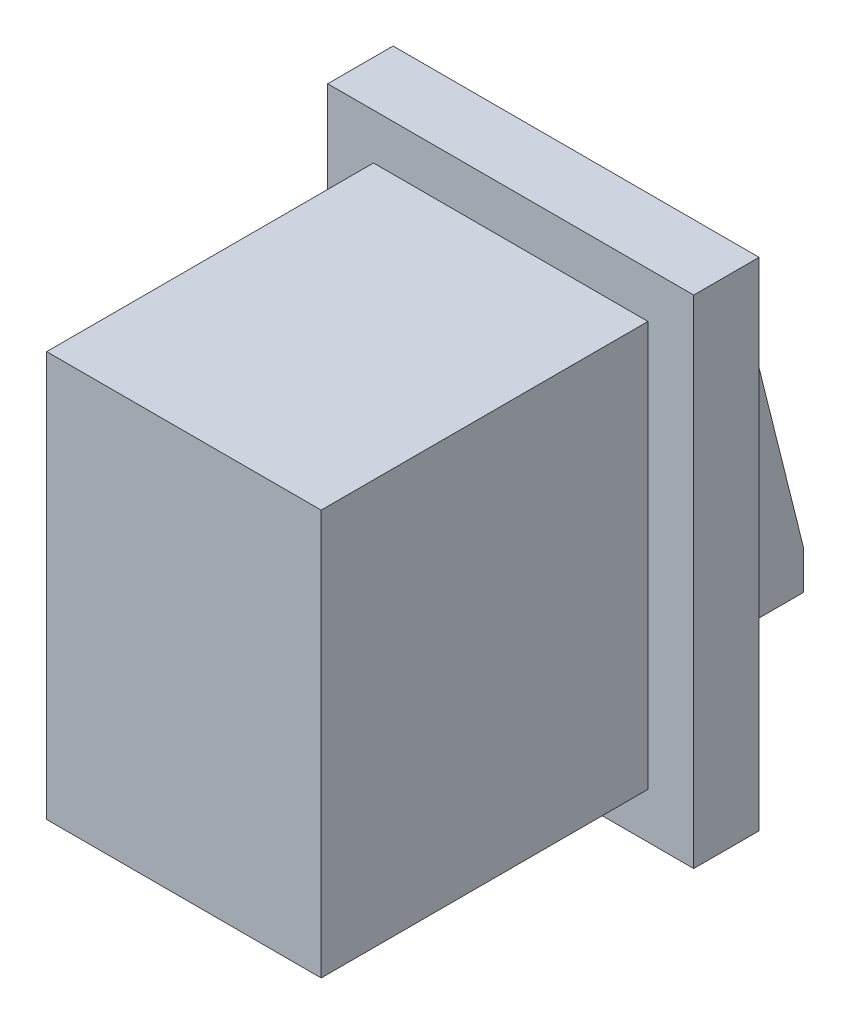
ISO-10303-21;
HEADER;
FILE_DESCRIPTION(('STEP AP214'),'2;1');
FILE_NAME('part.step','',(''),(''),'','','');
FILE_SCHEMA(('AUTOMOTIVE_DESIGN { 1 0 10303 214 1 1 1 1 }'));
ENDSEC;
DATA;
#1=APPLICATION_CONTEXT('core data for automotive mechanical design processes');
#2=APPLICATION_PROTOCOL_DEFINITION('international standard','automotive_design',2000,#1);
#3=PRODUCT_CONTEXT('',#1,'mechanical');
#4=PRODUCT('Part','Part','',(#3));
#5=PRODUCT_RELATED_PRODUCT_CATEGORY('part','',(#4));
#6=PRODUCT_DEFINITION_FORMATION('','',#4);
#7=PRODUCT_DEFINITION_CONTEXT('part definition',#1,'design');
#8=PRODUCT_DEFINITION('design','',#6,#7);
#9=PRODUCT_DEFINITION_SHAPE('','',#8);
#10=(LENGTH_UNIT() NAMED_UNIT(*) SI_UNIT(.MILLI.,.METRE.));
#11=(NAMED_UNIT(*) PLANE_ANGLE_UNIT() SI_UNIT($,.RADIAN.));
#12=(NAMED_UNIT(*) SI_UNIT($,.STERADIAN.) SOLID_ANGLE_UNIT());
#13=UNCERTAINTY_MEASURE_WITH_UNIT(LENGTH_MEASURE(1.E-05),#10,'distance_accuracy_value','');
#14=(GEOMETRIC_REPRESENTATION_CONTEXT(3) GLOBAL_UNCERTAINTY_ASSIGNED_CONTEXT((#13)) GLOBAL_UNIT_ASSIGNED_CONTEXT((#10,
#11,#12)) REPRESENTATION_CONTEXT('',''));
#15=CARTESIAN_POINT('',(0.,0.,0.));
#16=DIRECTION('',(0.,0.,1.));
#17=DIRECTION('',(1.,0.,0.));
#18=AXIS2_PLACEMENT_3D('',#15,#16,#17);
#19=CARTESIAN_POINT('',(0.,0.,-5.));
#20=DIRECTION('',(0.,0.,1.));
#21=DIRECTION('',(1.,0.,0.));
#22=AXIS2_PLACEMENT_3D('',#19,#20,#21);
#23=PLANE('',#22);
#24=DIRECTION('',(0.,1.,0.));
#25=VECTOR('',#24,1.);
#26=CARTESIAN_POINT('',(-14.,-19.,-5.));
#27=LINE('',#26,#25);
#28=CARTESIAN_POINT('',(-14.,-19.,-5.));
#29=VERTEX_POINT('',#28);
#30=CARTESIAN_POINT('',(-14.,19.,-5.));
#31=VERTEX_POINT('',#30);
#32=EDGE_CURVE('E166',#29,#31,#27,.T.);
#33=ORIENTED_EDGE('',*,*,#32,.T.);
#34=DIRECTION('',(1.,0.,0.));
#35=VECTOR('',#34,1.);
#36=CARTESIAN_POINT('',(14.,19.,-5.));
#37=LINE('',#36,#35);
#38=CARTESIAN_POINT('',(14.,19.,-5.));
#39=VERTEX_POINT('',#38);
#40=EDGE_CURVE('E169',#31,#39,#37,.T.);
#41=ORIENTED_EDGE('',*,*,#40,.T.);
#42=DIRECTION('',(0.,-1.,0.));
#43=VECTOR('',#42,1.);
#44=CARTESIAN_POINT('',(14.,-19.,-5.));
#45=LINE('',#44,#43);
#46=CARTESIAN_POINT('',(14.,-19.,-5.));
#47=VERTEX_POINT('',#46);
#48=EDGE_CURVE('E172',#39,#47,#45,.T.);
#49=ORIENTED_EDGE('',*,*,#48,.T.);
#50=DIRECTION('',(-1.,0.,0.));
#51=VECTOR('',#50,1.);
#52=CARTESIAN_POINT('',(14.,-19.,-5.));
#53=LINE('',#52,#51);
#54=EDGE_CURVE('E174',#47,#29,#53,.T.);
#55=ORIENTED_EDGE('',*,*,#54,.T.);
#56=EDGE_LOOP('',(#33,#41,#49,#55));
#57=FACE_BOUND('',#56,.T.);
#58=DIRECTION('',(0.,1.,0.));
#59=VECTOR('',#58,1.);
#60=CARTESIAN_POINT('',(-7.38426730612218,-11.5191078344026,-5.));
#61=LINE('',#60,#59);
#62=CARTESIAN_POINT('',(-7.38426730612218,-11.5191078344026,-5.));
#63=VERTEX_POINT('',#62);
#64=CARTESIAN_POINT('',(-7.38426730612218,11.5191078344026,-5.));
#65=VERTEX_POINT('',#64);
#66=EDGE_CURVE('E153',#63,#65,#61,.T.);
#67=ORIENTED_EDGE('',*,*,#66,.F.);
#68=DIRECTION('',(-1.,0.,0.));
#69=VECTOR('',#68,1.);
#70=CARTESIAN_POINT('',(7.38426730612218,-11.5191078344026,-5.));
#71=LINE('',#70,#69);
#72=CARTESIAN_POINT('',(7.38426730612218,-11.5191078344026,-5.));
#73=VERTEX_POINT('',#72);
#74=EDGE_CURVE('E160',#73,#63,#71,.T.);
#75=ORIENTED_EDGE('',*,*,#74,.F.);
#76=DIRECTION('',(0.,-1.,0.));
#77=VECTOR('',#76,1.);
#78=CARTESIAN_POINT('',(7.38426730612218,-11.5191078344026,-5.));
#79=LINE('',#78,#77);
#80=CARTESIAN_POINT('',(7.38426730612218,11.5191078344026,-5.));
#81=VERTEX_POINT('',#80);
#82=EDGE_CURVE('E140',#81,#73,#79,.T.);
#83=ORIENTED_EDGE('',*,*,#82,.F.);
#84=DIRECTION('',(1.,0.,0.));
#85=VECTOR('',#84,1.);
#86=CARTESIAN_POINT('',(7.38426730612218,11.5191078344026,-5.));
#87=LINE('',#86,#85);
#88=EDGE_CURVE('E156',#65,#81,#87,.T.);
#89=ORIENTED_EDGE('',*,*,#88,.F.);
#90=EDGE_LOOP('',(#67,#75,#83,#89));
#91=FACE_BOUND('',#90,.T.);
#92=ADVANCED_FACE('F32',(#57,#91),#23,.F.);
#93=CARTESIAN_POINT('',(10.5,-15.5,25.));
#94=DIRECTION('',(-1.,0.,0.));
#95=DIRECTION('',(0.,0.,1.));
#96=AXIS2_PLACEMENT_3D('',#93,#94,#95);
#97=PLANE('',#96);
#98=DIRECTION('',(0.,1.,0.));
#99=VECTOR('',#98,1.);
#100=CARTESIAN_POINT('',(10.5,-15.5,0.));
#101=LINE('',#100,#99);
#102=CARTESIAN_POINT('',(10.5,-15.5,0.));
#103=VERTEX_POINT('',#102);
#104=CARTESIAN_POINT('',(10.5,15.5,0.));
#105=VERTEX_POINT('',#104);
#106=EDGE_CURVE('E195',#103,#105,#101,.T.);
#107=ORIENTED_EDGE('',*,*,#106,.T.);
#108=DIRECTION('',(0.,0.,-1.));
#109=VECTOR('',#108,1.);
#110=CARTESIAN_POINT('',(10.5,15.5,25.));
#111=LINE('',#110,#109);
#112=CARTESIAN_POINT('',(10.5,15.5,25.));
#113=VERTEX_POINT('',#112);
#114=EDGE_CURVE('E225',#113,#105,#111,.T.);
#115=ORIENTED_EDGE('',*,*,#114,.F.);
#116=DIRECTION('',(0.,1.,0.));
#117=VECTOR('',#116,1.);
#118=CARTESIAN_POINT('',(10.5,-15.5,25.));
#119=LINE('',#118,#117);
#120=CARTESIAN_POINT('',(10.5,-15.5,25.));
#121=VERTEX_POINT('',#120);
#122=EDGE_CURVE('E196',#121,#113,#119,.T.);
#123=ORIENTED_EDGE('',*,*,#122,.F.);
#124=DIRECTION('',(0.,0.,-1.));
#125=VECTOR('',#124,1.);
#126=CARTESIAN_POINT('',(10.5,-15.5,25.));
#127=LINE('',#126,#125);
#128=EDGE_CURVE('E206',#121,#103,#127,.T.);
#129=ORIENTED_EDGE('',*,*,#128,.T.);
#130=EDGE_LOOP('',(#107,#115,#123,#129));
#131=FACE_BOUND('',#130,.T.);
#132=ADVANCED_FACE('F235',(#131),#97,.F.);
#133=CARTESIAN_POINT('',(-10.5,15.5,25.));
#134=DIRECTION('',(0.,-1.,0.));
#135=DIRECTION('',(0.,0.,-1.));
#136=AXIS2_PLACEMENT_3D('',#133,#134,#135);
#137=PLANE('',#136);
#138=DIRECTION('',(-1.,0.,0.));
#139=VECTOR('',#138,1.);
#140=CARTESIAN_POINT('',(-10.5,15.5,0.));
#141=LINE('',#140,#139);
#142=CARTESIAN_POINT('',(-10.5,15.5,0.));
#143=VERTEX_POINT('',#142);
#144=EDGE_CURVE('E209',#105,#143,#141,.T.);
#145=ORIENTED_EDGE('',*,*,#144,.T.);
#146=DIRECTION('',(0.,0.,-1.));
#147=VECTOR('',#146,1.);
#148=CARTESIAN_POINT('',(-10.5,15.5,25.));
#149=LINE('',#148,#147);
#150=CARTESIAN_POINT('',(-10.5,15.5,25.));
#151=VERTEX_POINT('',#150);
#152=EDGE_CURVE('E222',#151,#143,#149,.T.);
#153=ORIENTED_EDGE('',*,*,#152,.F.);
#154=DIRECTION('',(-1.,0.,0.));
#155=VECTOR('',#154,1.);
#156=CARTESIAN_POINT('',(-10.5,15.5,25.));
#157=LINE('',#156,#155);
#158=EDGE_CURVE('E199',#113,#151,#157,.T.);
#159=ORIENTED_EDGE('',*,*,#158,.F.);
#160=ORIENTED_EDGE('',*,*,#114,.T.);
#161=EDGE_LOOP('',(#145,#153,#159,#160));
#162=FACE_BOUND('',#161,.T.);
#163=ADVANCED_FACE('F231',(#162),#137,.F.);
#164=CARTESIAN_POINT('',(-10.5,-15.5,25.));
#165=DIRECTION('',(1.,0.,0.));
#166=DIRECTION('',(0.,0.,-1.));
#167=AXIS2_PLACEMENT_3D('',#164,#165,#166);
#168=PLANE('',#167);
#169=DIRECTION('',(0.,-1.,0.));
#170=VECTOR('',#169,1.);
#171=CARTESIAN_POINT('',(-10.5,-15.5,0.));
#172=LINE('',#171,#170);
#173=CARTESIAN_POINT('',(-10.5,-15.5,0.));
#174=VERTEX_POINT('',#173);
#175=EDGE_CURVE('E212',#143,#174,#172,.T.);
#176=ORIENTED_EDGE('',*,*,#175,.T.);
#177=DIRECTION('',(0.,0.,-1.));
#178=VECTOR('',#177,1.);
#179=CARTESIAN_POINT('',(-10.5,-15.5,25.));
#180=LINE('',#179,#178);
#181=CARTESIAN_POINT('',(-10.5,-15.5,25.));
#182=VERTEX_POINT('',#181);
#183=EDGE_CURVE('E219',#182,#174,#180,.T.);
#184=ORIENTED_EDGE('',*,*,#183,.F.);
#185=DIRECTION('',(0.,-1.,0.));
#186=VECTOR('',#185,1.);
#187=CARTESIAN_POINT('',(-10.5,-15.5,25.));
#188=LINE('',#187,#186);
#189=EDGE_CURVE('E202',#151,#182,#188,.T.);
#190=ORIENTED_EDGE('',*,*,#189,.F.);
#191=ORIENTED_EDGE('',*,*,#152,.T.);
#192=EDGE_LOOP('',(#176,#184,#190,#191));
#193=FACE_BOUND('',#192,.T.);
#194=ADVANCED_FACE('F245',(#193),#168,.F.);
#195=CARTESIAN_POINT('',(-10.5,-15.5,25.));
#196=DIRECTION('',(0.,1.,0.));
#197=DIRECTION('',(0.,0.,1.));
#198=AXIS2_PLACEMENT_3D('',#195,#196,#197);
#199=PLANE('',#198);
#200=DIRECTION('',(1.,0.,0.));
#201=VECTOR('',#200,1.);
#202=CARTESIAN_POINT('',(-10.5,-15.5,0.));
#203=LINE('',#202,#201);
#204=EDGE_CURVE('E200',#174,#103,#203,.T.);
#205=ORIENTED_EDGE('',*,*,#204,.T.);
#206=ORIENTED_EDGE('',*,*,#128,.F.);
#207=DIRECTION('',(1.,0.,0.));
#208=VECTOR('',#207,1.);
#209=CARTESIAN_POINT('',(-10.5,-15.5,25.));
#210=LINE('',#209,#208);
#211=EDGE_CURVE('E204',#182,#121,#210,.T.);
#212=ORIENTED_EDGE('',*,*,#211,.F.);
#213=ORIENTED_EDGE('',*,*,#183,.T.);
#214=EDGE_LOOP('',(#205,#206,#212,#213));
#215=FACE_BOUND('',#214,.T.);
#216=ADVANCED_FACE('F240',(#215),#199,.F.);
#217=CARTESIAN_POINT('',(0.,0.,25.));
#218=DIRECTION('',(0.,0.,-1.));
#219=DIRECTION('',(-1.,0.,0.));
#220=AXIS2_PLACEMENT_3D('',#217,#218,#219);
#221=PLANE('',#220);
#222=ORIENTED_EDGE('',*,*,#122,.T.);
#223=ORIENTED_EDGE('',*,*,#158,.T.);
#224=ORIENTED_EDGE('',*,*,#189,.T.);
#225=ORIENTED_EDGE('',*,*,#211,.T.);
#226=EDGE_LOOP('',(#222,#223,#224,#225));
#227=FACE_BOUND('',#226,.T.);
#228=ADVANCED_FACE('F247',(#227),#221,.F.);
#229=CARTESIAN_POINT('',(0.,0.,0.));
#230=DIRECTION('',(0.,0.,1.));
#231=DIRECTION('',(1.,0.,0.));
#232=AXIS2_PLACEMENT_3D('',#229,#230,#231);
#233=PLANE('',#232);
#234=DIRECTION('',(0.,1.,0.));
#235=VECTOR('',#234,1.);
#236=CARTESIAN_POINT('',(-14.,-19.,0.));
#237=LINE('',#236,#235);
#238=CARTESIAN_POINT('',(-14.,-19.,0.));
#239=VERTEX_POINT('',#238);
#240=CARTESIAN_POINT('',(-14.,19.,0.));
#241=VERTEX_POINT('',#240);
#242=EDGE_CURVE('E165',#239,#241,#237,.T.);
#243=ORIENTED_EDGE('',*,*,#242,.F.);
#244=DIRECTION('',(-1.,0.,0.));
#245=VECTOR('',#244,1.);
#246=CARTESIAN_POINT('',(14.,-19.,0.));
#247=LINE('',#246,#245);
#248=CARTESIAN_POINT('',(14.,-19.,0.));
#249=VERTEX_POINT('',#248);
#250=EDGE_CURVE('E170',#249,#239,#247,.T.);
#251=ORIENTED_EDGE('',*,*,#250,.F.);
#252=DIRECTION('',(0.,-1.,0.));
#253=VECTOR('',#252,1.);
#254=CARTESIAN_POINT('',(14.,-19.,0.));
#255=LINE('',#254,#253);
#256=CARTESIAN_POINT('',(14.,19.,0.));
#257=VERTEX_POINT('',#256);
#258=EDGE_CURVE('E181',#257,#249,#255,.T.);
#259=ORIENTED_EDGE('',*,*,#258,.F.);
#260=DIRECTION('',(1.,0.,0.));
#261=VECTOR('',#260,1.);
#262=CARTESIAN_POINT('',(14.,19.,0.));
#263=LINE('',#262,#261);
#264=EDGE_CURVE('E179',#241,#257,#263,.T.);
#265=ORIENTED_EDGE('',*,*,#264,.F.);
#266=EDGE_LOOP('',(#243,#251,#259,#265));
#267=FACE_BOUND('',#266,.T.);
#268=ORIENTED_EDGE('',*,*,#106,.F.);
#269=ORIENTED_EDGE('',*,*,#204,.F.);
#270=ORIENTED_EDGE('',*,*,#175,.F.);
#271=ORIENTED_EDGE('',*,*,#144,.F.);
#272=EDGE_LOOP('',(#268,#269,#270,#271));
#273=FACE_BOUND('',#272,.T.);
#274=ADVANCED_FACE('F238',(#267,#273),#233,.T.);
#275=CARTESIAN_POINT('',(-14.,-19.,-5.));
#276=DIRECTION('',(1.,0.,0.));
#277=DIRECTION('',(0.,0.,-1.));
#278=AXIS2_PLACEMENT_3D('',#275,#276,#277);
#279=PLANE('',#278);
#280=ORIENTED_EDGE('',*,*,#242,.T.);
#281=DIRECTION('',(0.,0.,1.));
#282=VECTOR('',#281,1.);
#283=CARTESIAN_POINT('',(-14.,19.,-5.));
#284=LINE('',#283,#282);
#285=EDGE_CURVE('E192',#31,#241,#284,.T.);
#286=ORIENTED_EDGE('',*,*,#285,.F.);
#287=ORIENTED_EDGE('',*,*,#32,.F.);
#288=DIRECTION('',(0.,0.,1.));
#289=VECTOR('',#288,1.);
#290=CARTESIAN_POINT('',(-14.,-19.,-5.));
#291=LINE('',#290,#289);
#292=EDGE_CURVE('E176',#29,#239,#291,.T.);
#293=ORIENTED_EDGE('',*,*,#292,.T.);
#294=EDGE_LOOP('',(#280,#286,#287,#293));
#295=FACE_BOUND('',#294,.T.);
#296=ADVANCED_FACE('F254',(#295),#279,.F.);
#297=CARTESIAN_POINT('',(14.,19.,-5.));
#298=DIRECTION('',(0.,-1.,0.));
#299=DIRECTION('',(0.,0.,-1.));
#300=AXIS2_PLACEMENT_3D('',#297,#298,#299);
#301=PLANE('',#300);
#302=ORIENTED_EDGE('',*,*,#264,.T.);
#303=DIRECTION('',(0.,0.,1.));
#304=VECTOR('',#303,1.);
#305=CARTESIAN_POINT('',(14.,19.,-5.));
#306=LINE('',#305,#304);
#307=EDGE_CURVE('E189',#39,#257,#306,.T.);
#308=ORIENTED_EDGE('',*,*,#307,.F.);
#309=ORIENTED_EDGE('',*,*,#40,.F.);
#310=ORIENTED_EDGE('',*,*,#285,.T.);
#311=EDGE_LOOP('',(#302,#308,#309,#310));
#312=FACE_BOUND('',#311,.T.);
#313=ADVANCED_FACE('F277',(#312),#301,.F.);
#314=CARTESIAN_POINT('',(14.,-19.,-5.));
#315=DIRECTION('',(-1.,0.,0.));
#316=DIRECTION('',(0.,0.,1.));
#317=AXIS2_PLACEMENT_3D('',#314,#315,#316);
#318=PLANE('',#317);
#319=ORIENTED_EDGE('',*,*,#258,.T.);
#320=DIRECTION('',(0.,0.,1.));
#321=VECTOR('',#320,1.);
#322=CARTESIAN_POINT('',(14.,-19.,-5.));
#323=LINE('',#322,#321);
#324=EDGE_CURVE('E186',#47,#249,#323,.T.);
#325=ORIENTED_EDGE('',*,*,#324,.F.);
#326=ORIENTED_EDGE('',*,*,#48,.F.);
#327=ORIENTED_EDGE('',*,*,#307,.T.);
#328=EDGE_LOOP('',(#319,#325,#326,#327));
#329=FACE_BOUND('',#328,.T.);
#330=ADVANCED_FACE('F273',(#329),#318,.F.);
#331=CARTESIAN_POINT('',(14.,-19.,-5.));
#332=DIRECTION('',(0.,1.,0.));
#333=DIRECTION('',(0.,0.,1.));
#334=AXIS2_PLACEMENT_3D('',#331,#332,#333);
#335=PLANE('',#334);
#336=ORIENTED_EDGE('',*,*,#250,.T.);
#337=ORIENTED_EDGE('',*,*,#292,.F.);
#338=ORIENTED_EDGE('',*,*,#54,.F.);
#339=ORIENTED_EDGE('',*,*,#324,.T.);
#340=EDGE_LOOP('',(#336,#337,#338,#339));
#341=FACE_BOUND('',#340,.T.);
#342=ADVANCED_FACE('F270',(#341),#335,.F.);
#343=CARTESIAN_POINT('',(-7.38426730612218,-11.5191078344026,-15.));
#344=DIRECTION('',(1.,0.,0.));
#345=DIRECTION('',(0.,0.,-1.));
#346=AXIS2_PLACEMENT_3D('',#343,#344,#345);
#347=PLANE('',#346);
#348=DIRECTION('',(0.,0.,1.));
#349=VECTOR('',#348,1.);
#350=CARTESIAN_POINT('',(-7.38426730612218,11.5191078344026,-15.));
#351=LINE('',#350,#349);
#352=CARTESIAN_POINT('',(-7.38426730612218,11.5191078344026,-9.99999999999999));
#353=VERTEX_POINT('',#352);
#354=EDGE_CURVE('E163',#353,#65,#351,.T.);
#355=ORIENTED_EDGE('',*,*,#354,.F.);
#356=DIRECTION('',(0.,0.970142500145333,0.24253562503633));
#357=VECTOR('',#356,1.);
#358=CARTESIAN_POINT('',(-7.38426730612218,-8.48089216559771,-15.));
#359=LINE('',#358,#357);
#360=CARTESIAN_POINT('',(-7.38426730612218,-8.48089216559771,-15.));
#361=VERTEX_POINT('',#360);
#362=EDGE_CURVE('E11',#353,#361,#359,.F.);
#363=ORIENTED_EDGE('',*,*,#362,.T.);
#364=DIRECTION('',(0.,1.,0.));
#365=VECTOR('',#364,1.);
#366=CARTESIAN_POINT('',(-7.38426730612218,-11.5191078344026,-15.));
#367=LINE('',#366,#365);
#368=CARTESIAN_POINT('',(-7.38426730612218,-11.5191078344026,-15.));
#369=VERTEX_POINT('',#368);
#370=EDGE_CURVE('E133',#369,#361,#367,.T.);
#371=ORIENTED_EDGE('',*,*,#370,.F.);
#372=DIRECTION('',(0.,0.,1.));
#373=VECTOR('',#372,1.);
#374=CARTESIAN_POINT('',(-7.38426730612218,-11.5191078344026,-15.));
#375=LINE('',#374,#373);
#376=EDGE_CURVE('E144',#369,#63,#375,.T.);
#377=ORIENTED_EDGE('',*,*,#376,.T.);
#378=ORIENTED_EDGE('',*,*,#66,.T.);
#379=EDGE_LOOP('',(#355,#363,#371,#377,#378));
#380=FACE_BOUND('',#379,.T.);
#381=ADVANCED_FACE('F267',(#380),#347,.F.);
#382=CARTESIAN_POINT('',(7.38426730612218,11.5191078344026,-15.));
#383=DIRECTION('',(0.,-1.,0.));
#384=DIRECTION('',(0.,0.,-1.));
#385=AXIS2_PLACEMENT_3D('',#382,#383,#384);
#386=PLANE('',#385);
#387=DIRECTION('',(0.,0.,1.));
#388=VECTOR('',#387,1.);
#389=CARTESIAN_POINT('',(7.38426730612218,11.5191078344026,-15.));
#390=LINE('',#389,#388);
#391=CARTESIAN_POINT('',(7.38426730612218,11.5191078344026,-9.99999999999999));
#392=VERTEX_POINT('',#391);
#393=EDGE_CURVE('E143',#392,#81,#390,.T.);
#394=ORIENTED_EDGE('',*,*,#393,.F.);
#395=DIRECTION('',(-1.,0.,0.));
#396=VECTOR('',#395,1.);
#397=CARTESIAN_POINT('',(7.38426730612218,11.5191078344026,-9.99999999999999));
#398=LINE('',#397,#396);
#399=EDGE_CURVE('E40',#392,#353,#398,.T.);
#400=ORIENTED_EDGE('',*,*,#399,.T.);
#401=ORIENTED_EDGE('',*,*,#354,.T.);
#402=ORIENTED_EDGE('',*,*,#88,.T.);
#403=EDGE_LOOP('',(#394,#400,#401,#402));
#404=FACE_BOUND('',#403,.T.);
#405=ADVANCED_FACE('F315',(#404),#386,.F.);
#406=CARTESIAN_POINT('',(7.38426730612218,-11.5191078344026,-15.));
#407=DIRECTION('',(-1.,0.,0.));
#408=DIRECTION('',(0.,0.,1.));
#409=AXIS2_PLACEMENT_3D('',#406,#407,#408);
#410=PLANE('',#409);
#411=DIRECTION('',(0.,-1.,0.));
#412=VECTOR('',#411,1.);
#413=CARTESIAN_POINT('',(7.38426730612218,-11.5191078344026,-15.));
#414=LINE('',#413,#412);
#415=CARTESIAN_POINT('',(7.38426730612218,-8.48089216559771,-15.));
#416=VERTEX_POINT('',#415);
#417=CARTESIAN_POINT('',(7.38426730612218,-11.5191078344026,-15.));
#418=VERTEX_POINT('',#417);
#419=EDGE_CURVE('E124',#416,#418,#414,.T.);
#420=ORIENTED_EDGE('',*,*,#419,.F.);
#421=DIRECTION('',(0.,-0.970142500145333,-0.24253562503633));
#422=VECTOR('',#421,1.);
#423=CARTESIAN_POINT('',(7.38426730612218,-8.48089216559771,-15.));
#424=LINE('',#423,#422);
#425=EDGE_CURVE('E54',#416,#392,#424,.F.);
#426=ORIENTED_EDGE('',*,*,#425,.T.);
#427=ORIENTED_EDGE('',*,*,#393,.T.);
#428=ORIENTED_EDGE('',*,*,#82,.T.);
#429=DIRECTION('',(0.,0.,1.));
#430=VECTOR('',#429,1.);
#431=CARTESIAN_POINT('',(7.38426730612218,-11.5191078344026,-15.));
#432=LINE('',#431,#430);
#433=EDGE_CURVE('E137',#418,#73,#432,.T.);
#434=ORIENTED_EDGE('',*,*,#433,.F.);
#435=EDGE_LOOP('',(#420,#426,#427,#428,#434));
#436=FACE_BOUND('',#435,.T.);
#437=ADVANCED_FACE('F138',(#436),#410,.F.);
#438=CARTESIAN_POINT('',(7.38426730612218,-11.5191078344026,-15.));
#439=DIRECTION('',(0.,1.,0.));
#440=DIRECTION('',(0.,0.,1.));
#441=AXIS2_PLACEMENT_3D('',#438,#439,#440);
#442=PLANE('',#441);
#443=ORIENTED_EDGE('',*,*,#74,.T.);
#444=ORIENTED_EDGE('',*,*,#376,.F.);
#445=DIRECTION('',(-1.,0.,0.));
#446=VECTOR('',#445,1.);
#447=CARTESIAN_POINT('',(7.38426730612218,-11.5191078344026,-15.));
#448=LINE('',#447,#446);
#449=EDGE_CURVE('E129',#418,#369,#448,.T.);
#450=ORIENTED_EDGE('',*,*,#449,.F.);
#451=ORIENTED_EDGE('',*,*,#433,.T.);
#452=EDGE_LOOP('',(#443,#444,#450,#451));
#453=FACE_BOUND('',#452,.T.);
#454=ADVANCED_FACE('F146',(#453),#442,.F.);
#455=CARTESIAN_POINT('',(0.,0.,-15.));
#456=DIRECTION('',(0.,0.,1.));
#457=DIRECTION('',(1.,0.,0.));
#458=AXIS2_PLACEMENT_3D('',#455,#456,#457);
#459=PLANE('',#458);
#460=ORIENTED_EDGE('',*,*,#370,.T.);
#461=DIRECTION('',(1.,0.,0.));
#462=VECTOR('',#461,1.);
#463=CARTESIAN_POINT('',(0.,-8.48089216559771,-15.));
#464=LINE('',#463,#462);
#465=EDGE_CURVE('E132',#361,#416,#464,.T.);
#466=ORIENTED_EDGE('',*,*,#465,.T.);
#467=ORIENTED_EDGE('',*,*,#419,.T.);
#468=ORIENTED_EDGE('',*,*,#449,.T.);
#469=EDGE_LOOP('',(#460,#466,#467,#468));
#470=FACE_BOUND('',#469,.T.);
#471=ADVANCED_FACE('F127',(#470),#459,.F.);
#472=CARTESIAN_POINT('',(0.,-8.48089216559771,-15.));
#473=DIRECTION('',(0.,-0.24253562503633,0.970142500145333));
#474=DIRECTION('',(1.,0.,0.));
#475=AXIS2_PLACEMENT_3D('',#472,#473,#474);
#476=PLANE('',#475);
#477=ORIENTED_EDGE('',*,*,#362,.F.);
#478=ORIENTED_EDGE('',*,*,#399,.F.);
#479=ORIENTED_EDGE('',*,*,#425,.F.);
#480=ORIENTED_EDGE('',*,*,#465,.F.);
#481=EDGE_LOOP('',(#477,#478,#479,#480));
#482=FACE_BOUND('',#481,.T.);
#483=ADVANCED_FACE('F34',(#482),#476,.F.);
#484=CLOSED_SHELL('',(#92,#132,#163,#194,#216,#228,#274,#296,#313,#330,#342,#381,#405,#437,#454,
#471,#483));
#485=MANIFOLD_SOLID_BREP('B2',#484);
#486=ADVANCED_BREP_SHAPE_REPRESENTATION('',(#18,#485),#14);
#487=SHAPE_DEFINITION_REPRESENTATION(#9,#486);
ENDSEC;
END-ISO-10303-21;
